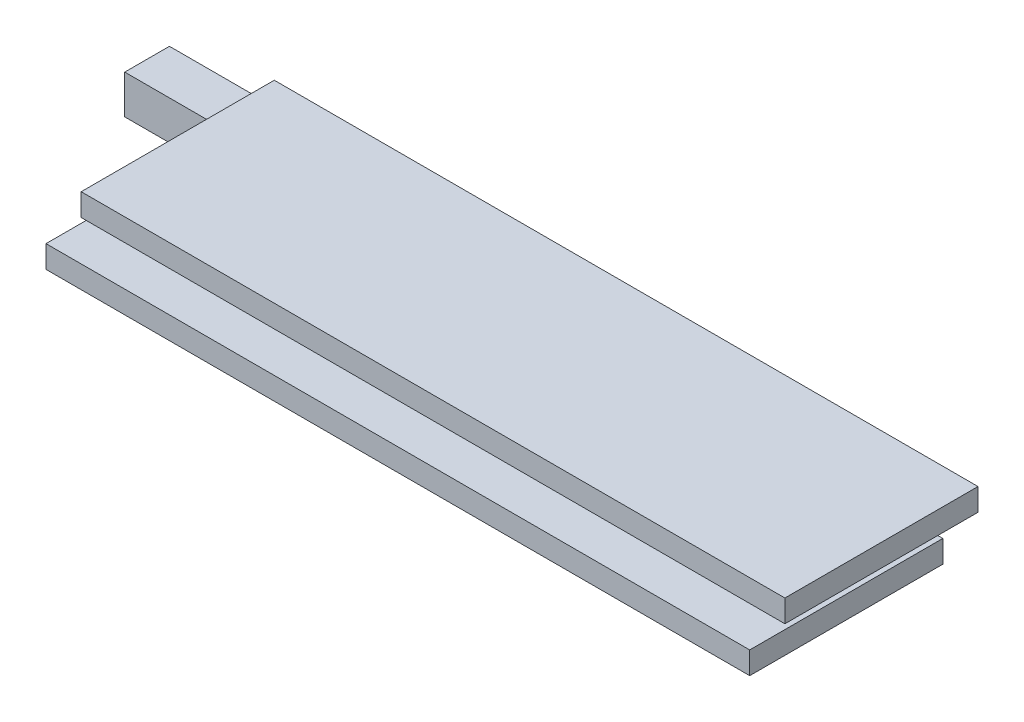
ISO-10303-21;
HEADER;
FILE_DESCRIPTION(('STEP AP214'),'2;1');
FILE_NAME('part.step','',(''),(''),'','','');
FILE_SCHEMA(('AUTOMOTIVE_DESIGN { 1 0 10303 214 1 1 1 1 }'));
ENDSEC;
DATA;
#1=APPLICATION_CONTEXT('core data for automotive mechanical design processes');
#2=APPLICATION_PROTOCOL_DEFINITION('international standard','automotive_design',2000,#1);
#3=PRODUCT_CONTEXT('',#1,'mechanical');
#4=PRODUCT('Part','Part','',(#3));
#5=PRODUCT_RELATED_PRODUCT_CATEGORY('part','',(#4));
#6=PRODUCT_DEFINITION_FORMATION('','',#4);
#7=PRODUCT_DEFINITION_CONTEXT('part definition',#1,'design');
#8=PRODUCT_DEFINITION('design','',#6,#7);
#9=PRODUCT_DEFINITION_SHAPE('','',#8);
#10=(LENGTH_UNIT() NAMED_UNIT(*) SI_UNIT(.MILLI.,.METRE.));
#11=(NAMED_UNIT(*) PLANE_ANGLE_UNIT() SI_UNIT($,.RADIAN.));
#12=(NAMED_UNIT(*) SI_UNIT($,.STERADIAN.) SOLID_ANGLE_UNIT());
#13=UNCERTAINTY_MEASURE_WITH_UNIT(LENGTH_MEASURE(1.E-05),#10,'distance_accuracy_value','');
#14=(GEOMETRIC_REPRESENTATION_CONTEXT(3) GLOBAL_UNCERTAINTY_ASSIGNED_CONTEXT((#13)) GLOBAL_UNIT_ASSIGNED_CONTEXT((#10,
#11,#12)) REPRESENTATION_CONTEXT('',''));
#15=CARTESIAN_POINT('',(0.,0.,0.));
#16=DIRECTION('',(0.,0.,1.));
#17=DIRECTION('',(1.,0.,0.));
#18=AXIS2_PLACEMENT_3D('',#15,#16,#17);
#19=CARTESIAN_POINT('',(133.89375,309.6625,27.44));
#20=DIRECTION('',(1.,0.,0.));
#21=DIRECTION('',(0.,0.,-1.));
#22=AXIS2_PLACEMENT_3D('',#19,#20,#21);
#23=PLANE('',#22);
#24=DIRECTION('',(0.,1.,0.));
#25=VECTOR('',#24,1.);
#26=CARTESIAN_POINT('',(133.89375,0.,6.35));
#27=LINE('',#26,#25);
#28=CARTESIAN_POINT('',(133.89375,309.5625,6.35));
#29=VERTEX_POINT('',#28);
#30=CARTESIAN_POINT('',(133.89375,309.6625,6.35));
#31=VERTEX_POINT('',#30);
#32=EDGE_CURVE('E221',#29,#31,#27,.T.);
#33=ORIENTED_EDGE('',*,*,#32,.T.);
#34=DIRECTION('',(0.,0.,-1.));
#35=VECTOR('',#34,1.);
#36=CARTESIAN_POINT('',(133.89375,309.6625,27.44));
#37=LINE('',#36,#35);
#38=CARTESIAN_POINT('',(133.89375,309.6625,0.));
#39=VERTEX_POINT('',#38);
#40=EDGE_CURVE('E179',#31,#39,#37,.T.);
#41=ORIENTED_EDGE('',*,*,#40,.T.);
#42=DIRECTION('',(0.,1.,0.));
#43=VECTOR('',#42,1.);
#44=CARTESIAN_POINT('',(133.89375,0.,0.));
#45=LINE('',#44,#43);
#46=CARTESIAN_POINT('',(133.89375,306.3875,0.));
#47=VERTEX_POINT('',#46);
#48=EDGE_CURVE('E211',#47,#39,#45,.T.);
#49=ORIENTED_EDGE('',*,*,#48,.F.);
#50=DIRECTION('',(0.,0.,-1.));
#51=VECTOR('',#50,1.);
#52=CARTESIAN_POINT('',(133.89375,306.3875,27.44));
#53=LINE('',#52,#51);
#54=CARTESIAN_POINT('',(133.89375,306.3875,27.44));
#55=VERTEX_POINT('',#54);
#56=EDGE_CURVE('E55',#55,#47,#53,.T.);
#57=ORIENTED_EDGE('',*,*,#56,.F.);
#58=DIRECTION('',(0.,1.,0.));
#59=VECTOR('',#58,1.);
#60=CARTESIAN_POINT('',(133.89375,0.,27.44));
#61=LINE('',#60,#59);
#62=CARTESIAN_POINT('',(133.89375,309.5625,27.44));
#63=VERTEX_POINT('',#62);
#64=EDGE_CURVE('E261',#55,#63,#61,.T.);
#65=ORIENTED_EDGE('',*,*,#64,.T.);
#66=DIRECTION('',(0.,0.,-1.));
#67=VECTOR('',#66,1.);
#68=CARTESIAN_POINT('',(133.89375,309.5625,27.44));
#69=LINE('',#68,#67);
#70=EDGE_CURVE('E223',#63,#29,#69,.T.);
#71=ORIENTED_EDGE('',*,*,#70,.T.);
#72=EDGE_LOOP('',(#33,#41,#49,#57,#65,#71));
#73=FACE_BOUND('',#72,.T.);
#74=ADVANCED_FACE('F38',(#73),#23,.F.);
#75=CARTESIAN_POINT('',(123.99375,309.6625,27.44));
#76=DIRECTION('',(0.,1.,0.));
#77=DIRECTION('',(0.,0.,1.));
#78=AXIS2_PLACEMENT_3D('',#75,#76,#77);
#79=PLANE('',#78);
#80=DIRECTION('',(-1.,0.,0.));
#81=VECTOR('',#80,1.);
#82=CARTESIAN_POINT('',(0.,309.6625,6.35));
#83=LINE('',#82,#81);
#84=CARTESIAN_POINT('',(123.99375,309.6625,6.35));
#85=VERTEX_POINT('',#84);
#86=EDGE_CURVE('E224',#31,#85,#83,.T.);
#87=ORIENTED_EDGE('',*,*,#86,.T.);
#88=DIRECTION('',(0.,0.,-1.));
#89=VECTOR('',#88,1.);
#90=CARTESIAN_POINT('',(123.99375,309.6625,27.44));
#91=LINE('',#90,#89);
#92=CARTESIAN_POINT('',(123.99375,309.6625,0.));
#93=VERTEX_POINT('',#92);
#94=EDGE_CURVE('E185',#85,#93,#91,.T.);
#95=ORIENTED_EDGE('',*,*,#94,.T.);
#96=DIRECTION('',(-1.,0.,0.));
#97=VECTOR('',#96,1.);
#98=CARTESIAN_POINT('',(0.,309.6625,0.));
#99=LINE('',#98,#97);
#100=EDGE_CURVE('E218',#39,#93,#99,.T.);
#101=ORIENTED_EDGE('',*,*,#100,.F.);
#102=ORIENTED_EDGE('',*,*,#40,.F.);
#103=EDGE_LOOP('',(#87,#95,#101,#102));
#104=FACE_BOUND('',#103,.T.);
#105=ADVANCED_FACE('F302',(#104),#79,.F.);
#106=CARTESIAN_POINT('',(138.89375,322.269005395767,27.44));
#107=DIRECTION('',(1.,0.,0.));
#108=DIRECTION('',(0.,0.,-1.));
#109=AXIS2_PLACEMENT_3D('',#106,#107,#108);
#110=PLANE('',#109);
#111=DIRECTION('',(0.,1.,0.));
#112=VECTOR('',#111,1.);
#113=CARTESIAN_POINT('',(138.89375,0.,6.35));
#114=LINE('',#113,#112);
#115=CARTESIAN_POINT('',(138.89375,315.1775,6.35));
#116=VERTEX_POINT('',#115);
#117=CARTESIAN_POINT('',(138.89375,315.2775,6.35));
#118=VERTEX_POINT('',#117);
#119=EDGE_CURVE('E232',#116,#118,#114,.T.);
#120=ORIENTED_EDGE('',*,*,#119,.T.);
#121=DIRECTION('',(0.,0.,-1.));
#122=VECTOR('',#121,1.);
#123=CARTESIAN_POINT('',(138.89375,315.2775,240.35));
#124=LINE('',#123,#122);
#125=CARTESIAN_POINT('',(138.89375,315.2775,27.44));
#126=VERTEX_POINT('',#125);
#127=EDGE_CURVE('E158',#126,#118,#124,.T.);
#128=ORIENTED_EDGE('',*,*,#127,.F.);
#129=DIRECTION('',(0.,1.,0.));
#130=VECTOR('',#129,1.);
#131=CARTESIAN_POINT('',(138.89375,0.,27.44));
#132=LINE('',#131,#130);
#133=CARTESIAN_POINT('',(138.89375,318.4525,27.44));
#134=VERTEX_POINT('',#133);
#135=EDGE_CURVE('E155',#126,#134,#132,.T.);
#136=ORIENTED_EDGE('',*,*,#135,.T.);
#137=DIRECTION('',(0.,0.,-1.));
#138=VECTOR('',#137,1.);
#139=CARTESIAN_POINT('',(138.89375,318.4525,240.35));
#140=LINE('',#139,#138);
#141=CARTESIAN_POINT('',(138.89375,318.4525,0.));
#142=VERTEX_POINT('',#141);
#143=EDGE_CURVE('E143',#134,#142,#140,.T.);
#144=ORIENTED_EDGE('',*,*,#143,.T.);
#145=DIRECTION('',(0.,1.,0.));
#146=VECTOR('',#145,1.);
#147=CARTESIAN_POINT('',(138.89375,0.,0.));
#148=LINE('',#147,#146);
#149=CARTESIAN_POINT('',(138.89375,315.1775,0.));
#150=VERTEX_POINT('',#149);
#151=EDGE_CURVE('E209',#150,#142,#148,.T.);
#152=ORIENTED_EDGE('',*,*,#151,.F.);
#153=DIRECTION('',(0.,0.,-1.));
#154=VECTOR('',#153,1.);
#155=CARTESIAN_POINT('',(138.89375,315.1775,27.44));
#156=LINE('',#155,#154);
#157=EDGE_CURVE('E170',#116,#150,#156,.T.);
#158=ORIENTED_EDGE('',*,*,#157,.F.);
#159=EDGE_LOOP('',(#120,#128,#136,#144,#152,#158));
#160=FACE_BOUND('',#159,.T.);
#161=ADVANCED_FACE('F157',(#160),#110,.F.);
#162=CARTESIAN_POINT('',(138.89375,315.1775,27.44));
#163=DIRECTION('',(0.,-1.,0.));
#164=DIRECTION('',(0.,0.,-1.));
#165=AXIS2_PLACEMENT_3D('',#162,#163,#164);
#166=PLANE('',#165);
#167=DIRECTION('',(1.,0.,0.));
#168=VECTOR('',#167,1.);
#169=CARTESIAN_POINT('',(0.,315.1775,6.35));
#170=LINE('',#169,#168);
#171=CARTESIAN_POINT('',(123.99375,315.1775,6.35));
#172=VERTEX_POINT('',#171);
#173=EDGE_CURVE('E229',#172,#116,#170,.T.);
#174=ORIENTED_EDGE('',*,*,#173,.T.);
#175=ORIENTED_EDGE('',*,*,#157,.T.);
#176=DIRECTION('',(1.,0.,0.));
#177=VECTOR('',#176,1.);
#178=CARTESIAN_POINT('',(0.,315.1775,0.));
#179=LINE('',#178,#177);
#180=CARTESIAN_POINT('',(123.99375,315.1775,0.));
#181=VERTEX_POINT('',#180);
#182=EDGE_CURVE('E212',#181,#150,#179,.T.);
#183=ORIENTED_EDGE('',*,*,#182,.F.);
#184=DIRECTION('',(0.,0.,-1.));
#185=VECTOR('',#184,1.);
#186=CARTESIAN_POINT('',(123.99375,315.1775,27.44));
#187=LINE('',#186,#185);
#188=EDGE_CURVE('E237',#172,#181,#187,.T.);
#189=ORIENTED_EDGE('',*,*,#188,.F.);
#190=EDGE_LOOP('',(#174,#175,#183,#189));
#191=FACE_BOUND('',#190,.T.);
#192=ADVANCED_FACE('F290',(#191),#166,.F.);
#193=CARTESIAN_POINT('',(123.99375,315.1775,27.44));
#194=DIRECTION('',(1.,0.,0.));
#195=DIRECTION('',(0.,0.,-1.));
#196=AXIS2_PLACEMENT_3D('',#193,#194,#195);
#197=PLANE('',#196);
#198=DIRECTION('',(0.,1.,0.));
#199=VECTOR('',#198,1.);
#200=CARTESIAN_POINT('',(123.99375,0.,6.35));
#201=LINE('',#200,#199);
#202=EDGE_CURVE('E226',#85,#172,#201,.T.);
#203=ORIENTED_EDGE('',*,*,#202,.T.);
#204=ORIENTED_EDGE('',*,*,#188,.T.);
#205=DIRECTION('',(0.,1.,0.));
#206=VECTOR('',#205,1.);
#207=CARTESIAN_POINT('',(123.99375,0.,0.));
#208=LINE('',#207,#206);
#209=EDGE_CURVE('E215',#93,#181,#208,.T.);
#210=ORIENTED_EDGE('',*,*,#209,.F.);
#211=ORIENTED_EDGE('',*,*,#94,.F.);
#212=EDGE_LOOP('',(#203,#204,#210,#211));
#213=FACE_BOUND('',#212,.T.);
#214=ADVANCED_FACE('F306',(#213),#197,.F.);
#215=CARTESIAN_POINT('',(238.89375,315.2775,27.44));
#216=DIRECTION('',(-1.,0.,0.));
#217=DIRECTION('',(0.,0.,1.));
#218=AXIS2_PLACEMENT_3D('',#215,#216,#217);
#219=PLANE('',#218);
#220=DIRECTION('',(0.,0.,1.));
#221=VECTOR('',#220,1.);
#222=CARTESIAN_POINT('',(238.89375,318.4525,240.35));
#223=LINE('',#222,#221);
#224=CARTESIAN_POINT('',(238.89375,318.4525,0.));
#225=VERTEX_POINT('',#224);
#226=CARTESIAN_POINT('',(238.89375,318.4525,27.44));
#227=VERTEX_POINT('',#226);
#228=EDGE_CURVE('E152',#225,#227,#223,.T.);
#229=ORIENTED_EDGE('',*,*,#228,.T.);
#230=DIRECTION('',(0.,-1.,0.));
#231=VECTOR('',#230,1.);
#232=CARTESIAN_POINT('',(238.89375,0.,27.44));
#233=LINE('',#232,#231);
#234=CARTESIAN_POINT('',(238.89375,315.2775,27.44));
#235=VERTEX_POINT('',#234);
#236=EDGE_CURVE('E163',#227,#235,#233,.T.);
#237=ORIENTED_EDGE('',*,*,#236,.T.);
#238=DIRECTION('',(0.,0.,1.));
#239=VECTOR('',#238,1.);
#240=CARTESIAN_POINT('',(238.89375,315.2775,240.35));
#241=LINE('',#240,#239);
#242=CARTESIAN_POINT('',(238.89375,315.2775,0.));
#243=VERTEX_POINT('',#242);
#244=EDGE_CURVE('E207',#243,#235,#241,.T.);
#245=ORIENTED_EDGE('',*,*,#244,.F.);
#246=DIRECTION('',(0.,-1.,0.));
#247=VECTOR('',#246,1.);
#248=CARTESIAN_POINT('',(238.89375,0.,0.));
#249=LINE('',#248,#247);
#250=EDGE_CURVE('E174',#225,#243,#249,.T.);
#251=ORIENTED_EDGE('',*,*,#250,.F.);
#252=EDGE_LOOP('',(#229,#237,#245,#251));
#253=FACE_BOUND('',#252,.T.);
#254=ADVANCED_FACE('F172',(#253),#219,.F.);
#255=CARTESIAN_POINT('',(223.89375,315.2775,27.44));
#256=DIRECTION('',(0.,1.,0.));
#257=DIRECTION('',(0.,0.,1.));
#258=AXIS2_PLACEMENT_3D('',#255,#256,#257);
#259=PLANE('',#258);
#260=DIRECTION('',(-1.,0.,0.));
#261=VECTOR('',#260,1.);
#262=CARTESIAN_POINT('',(0.,315.2775,0.));
#263=LINE('',#262,#261);
#264=CARTESIAN_POINT('',(223.89375,315.2775,0.));
#265=VERTEX_POINT('',#264);
#266=EDGE_CURVE('E192',#243,#265,#263,.T.);
#267=ORIENTED_EDGE('',*,*,#266,.F.);
#268=ORIENTED_EDGE('',*,*,#244,.T.);
#269=DIRECTION('',(1.,0.,0.));
#270=VECTOR('',#269,1.);
#271=CARTESIAN_POINT('',(0.,315.2775,27.44));
#272=LINE('',#271,#270);
#273=EDGE_CURVE('E47',#126,#235,#272,.T.);
#274=ORIENTED_EDGE('',*,*,#273,.F.);
#275=ORIENTED_EDGE('',*,*,#127,.T.);
#276=DIRECTION('',(1.,0.,0.));
#277=VECTOR('',#276,1.);
#278=CARTESIAN_POINT('',(0.,315.2775,6.35));
#279=LINE('',#278,#277);
#280=CARTESIAN_POINT('',(223.89375,315.2775,6.35));
#281=VERTEX_POINT('',#280);
#282=EDGE_CURVE('E194',#118,#281,#279,.T.);
#283=ORIENTED_EDGE('',*,*,#282,.T.);
#284=DIRECTION('',(0.,0.,-1.));
#285=VECTOR('',#284,1.);
#286=CARTESIAN_POINT('',(223.89375,315.2775,27.44));
#287=LINE('',#286,#285);
#288=EDGE_CURVE('E42',#281,#265,#287,.T.);
#289=ORIENTED_EDGE('',*,*,#288,.T.);
#290=EDGE_LOOP('',(#267,#268,#274,#275,#283,#289));
#291=FACE_BOUND('',#290,.T.);
#292=ADVANCED_FACE('F191',(#291),#259,.F.);
#293=CARTESIAN_POINT('',(223.89375,309.5625,27.44));
#294=DIRECTION('',(-1.,0.,0.));
#295=DIRECTION('',(0.,0.,1.));
#296=AXIS2_PLACEMENT_3D('',#293,#294,#295);
#297=PLANE('',#296);
#298=DIRECTION('',(0.,-1.,0.));
#299=VECTOR('',#298,1.);
#300=CARTESIAN_POINT('',(223.89375,0.,6.35));
#301=LINE('',#300,#299);
#302=CARTESIAN_POINT('',(223.89375,309.5625,6.35));
#303=VERTEX_POINT('',#302);
#304=EDGE_CURVE('E234',#281,#303,#301,.T.);
#305=ORIENTED_EDGE('',*,*,#304,.T.);
#306=DIRECTION('',(0.,0.,-1.));
#307=VECTOR('',#306,1.);
#308=CARTESIAN_POINT('',(223.89375,309.5625,27.44));
#309=LINE('',#308,#307);
#310=CARTESIAN_POINT('',(223.89375,309.5625,0.));
#311=VERTEX_POINT('',#310);
#312=EDGE_CURVE('E177',#303,#311,#309,.T.);
#313=ORIENTED_EDGE('',*,*,#312,.T.);
#314=DIRECTION('',(0.,-1.,0.));
#315=VECTOR('',#314,1.);
#316=CARTESIAN_POINT('',(223.89375,0.,0.));
#317=LINE('',#316,#315);
#318=EDGE_CURVE('E196',#265,#311,#317,.T.);
#319=ORIENTED_EDGE('',*,*,#318,.F.);
#320=ORIENTED_EDGE('',*,*,#288,.F.);
#321=EDGE_LOOP('',(#305,#313,#319,#320));
#322=FACE_BOUND('',#321,.T.);
#323=ADVANCED_FACE('F197',(#322),#297,.F.);
#324=CARTESIAN_POINT('',(233.89375,300.030192270938,27.44));
#325=DIRECTION('',(-1.,0.,0.));
#326=DIRECTION('',(0.,0.,1.));
#327=AXIS2_PLACEMENT_3D('',#324,#325,#326);
#328=PLANE('',#327);
#329=DIRECTION('',(0.,-1.,0.));
#330=VECTOR('',#329,1.);
#331=CARTESIAN_POINT('',(233.89375,0.,0.));
#332=LINE('',#331,#330);
#333=CARTESIAN_POINT('',(233.89375,309.5625,0.));
#334=VERTEX_POINT('',#333);
#335=CARTESIAN_POINT('',(233.89375,306.3875,0.));
#336=VERTEX_POINT('',#335);
#337=EDGE_CURVE('E203',#334,#336,#332,.T.);
#338=ORIENTED_EDGE('',*,*,#337,.F.);
#339=DIRECTION('',(0.,0.,-1.));
#340=VECTOR('',#339,1.);
#341=CARTESIAN_POINT('',(233.89375,309.5625,27.44));
#342=LINE('',#341,#340);
#343=CARTESIAN_POINT('',(233.89375,309.5625,27.44));
#344=VERTEX_POINT('',#343);
#345=EDGE_CURVE('E220',#344,#334,#342,.T.);
#346=ORIENTED_EDGE('',*,*,#345,.F.);
#347=DIRECTION('',(0.,-1.,0.));
#348=VECTOR('',#347,1.);
#349=CARTESIAN_POINT('',(233.89375,0.,27.44));
#350=LINE('',#349,#348);
#351=CARTESIAN_POINT('',(233.89375,306.3875,27.44));
#352=VERTEX_POINT('',#351);
#353=EDGE_CURVE('E151',#344,#352,#350,.T.);
#354=ORIENTED_EDGE('',*,*,#353,.T.);
#355=DIRECTION('',(0.,0.,1.));
#356=VECTOR('',#355,1.);
#357=CARTESIAN_POINT('',(233.89375,306.3875,27.44));
#358=LINE('',#357,#356);
#359=EDGE_CURVE('E63',#336,#352,#358,.T.);
#360=ORIENTED_EDGE('',*,*,#359,.F.);
#361=EDGE_LOOP('',(#338,#346,#354,#360));
#362=FACE_BOUND('',#361,.T.);
#363=ADVANCED_FACE('F269',(#362),#328,.F.);
#364=CARTESIAN_POINT('',(233.89375,309.5625,27.44));
#365=DIRECTION('',(0.,-1.,0.));
#366=DIRECTION('',(1.,0.,0.));
#367=AXIS2_PLACEMENT_3D('',#364,#365,#366);
#368=PLANE('',#367);
#369=ORIENTED_EDGE('',*,*,#312,.F.);
#370=DIRECTION('',(1.,0.,0.));
#371=VECTOR('',#370,1.);
#372=CARTESIAN_POINT('',(0.,309.5625,6.35));
#373=LINE('',#372,#371);
#374=EDGE_CURVE('E246',#29,#303,#373,.T.);
#375=ORIENTED_EDGE('',*,*,#374,.F.);
#376=ORIENTED_EDGE('',*,*,#70,.F.);
#377=DIRECTION('',(1.,0.,0.));
#378=VECTOR('',#377,1.);
#379=CARTESIAN_POINT('',(0.,309.5625,27.44));
#380=LINE('',#379,#378);
#381=EDGE_CURVE('E254',#63,#344,#380,.T.);
#382=ORIENTED_EDGE('',*,*,#381,.T.);
#383=ORIENTED_EDGE('',*,*,#345,.T.);
#384=DIRECTION('',(1.,0.,0.));
#385=VECTOR('',#384,1.);
#386=CARTESIAN_POINT('',(-1.71841707530262E-12,309.562499999999,0.));
#387=LINE('',#386,#385);
#388=EDGE_CURVE('E200',#311,#334,#387,.T.);
#389=ORIENTED_EDGE('',*,*,#388,.F.);
#390=EDGE_LOOP('',(#369,#375,#376,#382,#383,#389));
#391=FACE_BOUND('',#390,.T.);
#392=ADVANCED_FACE('F297',(#391),#368,.F.);
#393=CARTESIAN_POINT('',(0.,306.3875,27.44));
#394=DIRECTION('',(0.,1.,0.));
#395=DIRECTION('',(-1.,0.,0.));
#396=AXIS2_PLACEMENT_3D('',#393,#394,#395);
#397=PLANE('',#396);
#398=DIRECTION('',(1.,0.,0.));
#399=VECTOR('',#398,1.);
#400=CARTESIAN_POINT('',(0.,306.3875,27.44));
#401=LINE('',#400,#399);
#402=EDGE_CURVE('E251',#55,#352,#401,.T.);
#403=ORIENTED_EDGE('',*,*,#402,.F.);
#404=ORIENTED_EDGE('',*,*,#56,.T.);
#405=DIRECTION('',(1.,0.,0.));
#406=VECTOR('',#405,1.);
#407=CARTESIAN_POINT('',(0.,306.3875,0.));
#408=LINE('',#407,#406);
#409=EDGE_CURVE('E249',#47,#336,#408,.T.);
#410=ORIENTED_EDGE('',*,*,#409,.T.);
#411=ORIENTED_EDGE('',*,*,#359,.T.);
#412=EDGE_LOOP('',(#403,#404,#410,#411));
#413=FACE_BOUND('',#412,.T.);
#414=ADVANCED_FACE('F274',(#413),#397,.F.);
#415=CARTESIAN_POINT('',(0.,0.,27.44));
#416=DIRECTION('',(0.,0.,1.));
#417=DIRECTION('',(1.,0.,0.));
#418=AXIS2_PLACEMENT_3D('',#415,#416,#417);
#419=PLANE('',#418);
#420=ORIENTED_EDGE('',*,*,#64,.F.);
#421=ORIENTED_EDGE('',*,*,#402,.T.);
#422=ORIENTED_EDGE('',*,*,#353,.F.);
#423=ORIENTED_EDGE('',*,*,#381,.F.);
#424=EDGE_LOOP('',(#420,#421,#422,#423));
#425=FACE_BOUND('',#424,.T.);
#426=ADVANCED_FACE('F273',(#425),#419,.T.);
#427=CARTESIAN_POINT('',(0.,0.,0.));
#428=DIRECTION('',(0.,0.,1.));
#429=DIRECTION('',(1.,0.,0.));
#430=AXIS2_PLACEMENT_3D('',#427,#428,#429);
#431=PLANE('',#430);
#432=ORIENTED_EDGE('',*,*,#151,.T.);
#433=DIRECTION('',(1.,0.,0.));
#434=VECTOR('',#433,1.);
#435=CARTESIAN_POINT('',(0.,318.4525,0.));
#436=LINE('',#435,#434);
#437=EDGE_CURVE('E149',#142,#225,#436,.T.);
#438=ORIENTED_EDGE('',*,*,#437,.T.);
#439=ORIENTED_EDGE('',*,*,#250,.T.);
#440=ORIENTED_EDGE('',*,*,#266,.T.);
#441=ORIENTED_EDGE('',*,*,#318,.T.);
#442=ORIENTED_EDGE('',*,*,#388,.T.);
#443=ORIENTED_EDGE('',*,*,#337,.T.);
#444=ORIENTED_EDGE('',*,*,#409,.F.);
#445=ORIENTED_EDGE('',*,*,#48,.T.);
#446=ORIENTED_EDGE('',*,*,#100,.T.);
#447=ORIENTED_EDGE('',*,*,#209,.T.);
#448=ORIENTED_EDGE('',*,*,#182,.T.);
#449=EDGE_LOOP('',(#432,#438,#439,#440,#441,#442,#443,#444,#445,#446,#447,#448));
#450=FACE_BOUND('',#449,.T.);
#451=ADVANCED_FACE('F286',(#450),#431,.F.);
#452=CARTESIAN_POINT('',(0.,318.4525,240.35));
#453=DIRECTION('',(0.,1.,0.));
#454=DIRECTION('',(0.,0.,1.));
#455=AXIS2_PLACEMENT_3D('',#452,#453,#454);
#456=PLANE('',#455);
#457=ORIENTED_EDGE('',*,*,#143,.F.);
#458=DIRECTION('',(1.,0.,0.));
#459=VECTOR('',#458,1.);
#460=CARTESIAN_POINT('',(0.,318.4525,27.44));
#461=LINE('',#460,#459);
#462=EDGE_CURVE('E11',#134,#227,#461,.T.);
#463=ORIENTED_EDGE('',*,*,#462,.T.);
#464=ORIENTED_EDGE('',*,*,#228,.F.);
#465=ORIENTED_EDGE('',*,*,#437,.F.);
#466=EDGE_LOOP('',(#457,#463,#464,#465));
#467=FACE_BOUND('',#466,.T.);
#468=ADVANCED_FACE('F145',(#467),#456,.T.);
#469=CARTESIAN_POINT('',(0.,0.,27.44));
#470=DIRECTION('',(0.,0.,1.));
#471=DIRECTION('',(1.,0.,0.));
#472=AXIS2_PLACEMENT_3D('',#469,#470,#471);
#473=PLANE('',#472);
#474=ORIENTED_EDGE('',*,*,#135,.F.);
#475=ORIENTED_EDGE('',*,*,#273,.T.);
#476=ORIENTED_EDGE('',*,*,#236,.F.);
#477=ORIENTED_EDGE('',*,*,#462,.F.);
#478=EDGE_LOOP('',(#474,#475,#476,#477));
#479=FACE_BOUND('',#478,.T.);
#480=ADVANCED_FACE('F165',(#479),#473,.T.);
#481=CARTESIAN_POINT('',(0.,0.,6.35));
#482=DIRECTION('',(0.,0.,1.));
#483=DIRECTION('',(1.,0.,0.));
#484=AXIS2_PLACEMENT_3D('',#481,#482,#483);
#485=PLANE('',#484);
#486=ORIENTED_EDGE('',*,*,#32,.F.);
#487=ORIENTED_EDGE('',*,*,#374,.T.);
#488=ORIENTED_EDGE('',*,*,#304,.F.);
#489=ORIENTED_EDGE('',*,*,#282,.F.);
#490=ORIENTED_EDGE('',*,*,#119,.F.);
#491=ORIENTED_EDGE('',*,*,#173,.F.);
#492=ORIENTED_EDGE('',*,*,#202,.F.);
#493=ORIENTED_EDGE('',*,*,#86,.F.);
#494=EDGE_LOOP('',(#486,#487,#488,#489,#490,#491,#492,#493));
#495=FACE_BOUND('',#494,.T.);
#496=ADVANCED_FACE('F40',(#495),#485,.T.);
#497=CLOSED_SHELL('',(#74,#105,#161,#192,#214,#254,#292,#323,#363,#392,#414,#426,#451,#468,#480,#496));
#498=MANIFOLD_SOLID_BREP('B2',#497);
#499=ADVANCED_BREP_SHAPE_REPRESENTATION('',(#18,#498),#14);
#500=SHAPE_DEFINITION_REPRESENTATION(#9,#499);
ENDSEC;
END-ISO-10303-21;
